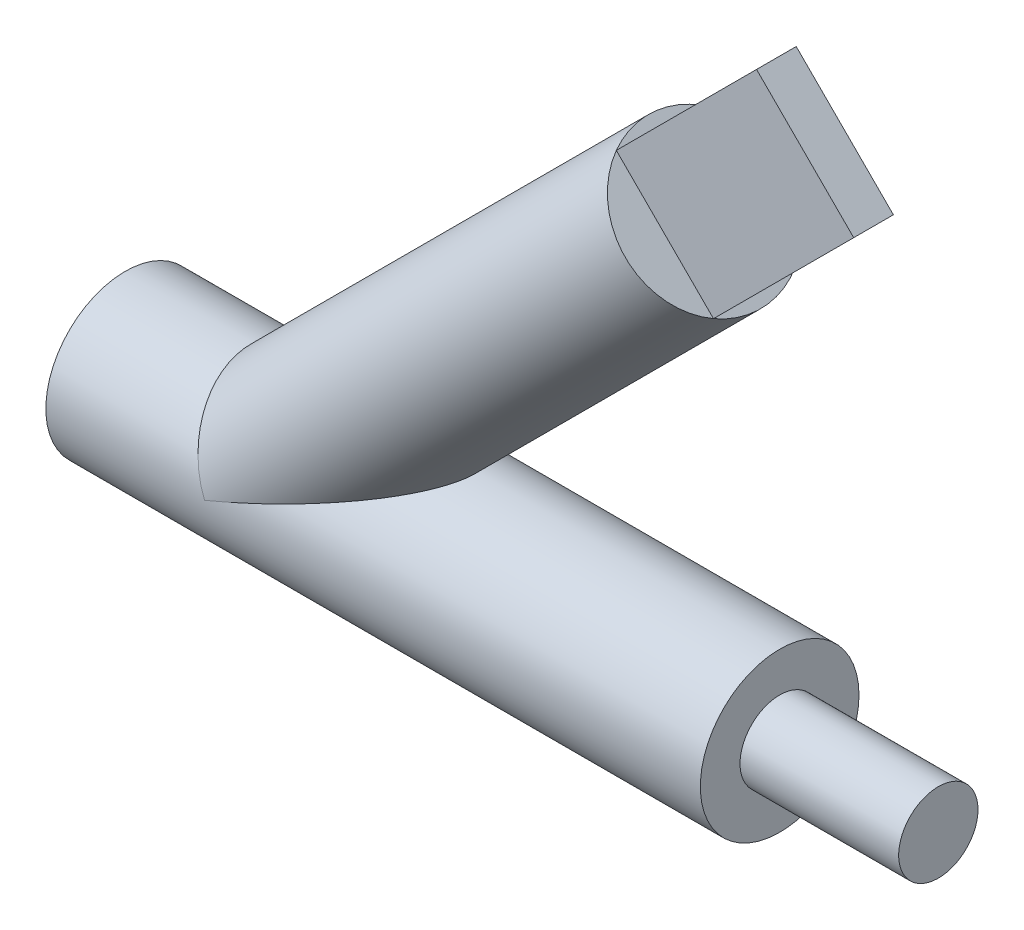
ISO-10303-21;
HEADER;
FILE_DESCRIPTION(('STEP AP214'),'2;1');
FILE_NAME('part.step','',(''),(''),'','','');
FILE_SCHEMA(('AUTOMOTIVE_DESIGN { 1 0 10303 214 1 1 1 1 }'));
ENDSEC;
DATA;
#1=APPLICATION_CONTEXT('core data for automotive mechanical design processes');
#2=APPLICATION_PROTOCOL_DEFINITION('international standard','automotive_design',2000,#1);
#3=PRODUCT_CONTEXT('',#1,'mechanical');
#4=PRODUCT('Part','Part','',(#3));
#5=PRODUCT_RELATED_PRODUCT_CATEGORY('part','',(#4));
#6=PRODUCT_DEFINITION_FORMATION('','',#4);
#7=PRODUCT_DEFINITION_CONTEXT('part definition',#1,'design');
#8=PRODUCT_DEFINITION('design','',#6,#7);
#9=PRODUCT_DEFINITION_SHAPE('','',#8);
#10=(LENGTH_UNIT() NAMED_UNIT(*) SI_UNIT(.MILLI.,.METRE.));
#11=(NAMED_UNIT(*) PLANE_ANGLE_UNIT() SI_UNIT($,.RADIAN.));
#12=(NAMED_UNIT(*) SI_UNIT($,.STERADIAN.) SOLID_ANGLE_UNIT());
#13=UNCERTAINTY_MEASURE_WITH_UNIT(LENGTH_MEASURE(1.E-05),#10,'distance_accuracy_value','');
#14=(GEOMETRIC_REPRESENTATION_CONTEXT(3) GLOBAL_UNCERTAINTY_ASSIGNED_CONTEXT((#13)) GLOBAL_UNIT_ASSIGNED_CONTEXT((#10,
#11,#12)) REPRESENTATION_CONTEXT('',''));
#15=CARTESIAN_POINT('',(0.,0.,0.));
#16=DIRECTION('',(0.,0.,1.));
#17=DIRECTION('',(1.,0.,0.));
#18=AXIS2_PLACEMENT_3D('',#15,#16,#17);
#19=CARTESIAN_POINT('',(146.066017177982,106.066017177982,0.));
#20=DIRECTION('',(0.707106781186549,0.707106781186546,0.));
#21=DIRECTION('',(-0.707106781186546,0.707106781186549,0.));
#22=AXIS2_PLACEMENT_3D('',#19,#20,#21);
#23=PLANE('',#22);
#24=DIRECTION('',(-0.707106781186546,0.707106781186549,0.));
#25=VECTOR('',#24,1.);
#26=CARTESIAN_POINT('',(126.066017177982,126.066017177982,0.));
#27=LINE('',#26,#25);
#28=CARTESIAN_POINT('',(158.313465891898,93.8185684640661,0.));
#29=VERTEX_POINT('',#28);
#30=CARTESIAN_POINT('',(133.818568464067,118.313465891898,0.));
#31=VERTEX_POINT('',#30);
#32=EDGE_CURVE('E52',#29,#31,#27,.T.);
#33=ORIENTED_EDGE('',*,*,#32,.F.);
#34=DIRECTION('',(0.,0.,1.));
#35=VECTOR('',#34,1.);
#36=CARTESIAN_POINT('',(158.313465891898,93.8185684640661,0.));
#37=LINE('',#36,#35);
#38=CARTESIAN_POINT('',(158.313465891898,93.818568464066,10.));
#39=VERTEX_POINT('',#38);
#40=EDGE_CURVE('E101',#29,#39,#37,.T.);
#41=ORIENTED_EDGE('',*,*,#40,.T.);
#42=CARTESIAN_POINT('',(146.066017177982,106.066017177982,0.));
#43=DIRECTION('',(0.707106781186549,0.707106781186546,0.));
#44=DIRECTION('',(-0.707106781186546,0.707106781186549,0.));
#45=AXIS2_PLACEMENT_3D('',#42,#43,#44);
#46=CIRCLE('',#45,20.);
#47=CARTESIAN_POINT('',(133.818568464067,118.313465891898,10.));
#48=VERTEX_POINT('',#47);
#49=EDGE_CURVE('E104',#39,#48,#46,.T.);
#50=ORIENTED_EDGE('',*,*,#49,.T.);
#51=DIRECTION('',(0.,0.,1.));
#52=VECTOR('',#51,1.);
#53=CARTESIAN_POINT('',(133.818568464067,118.313465891898,0.));
#54=LINE('',#53,#52);
#55=EDGE_CURVE('E57',#31,#48,#54,.T.);
#56=ORIENTED_EDGE('',*,*,#55,.F.);
#57=EDGE_LOOP('',(#33,#41,#50,#56));
#58=FACE_BOUND('',#57,.T.);
#59=ADVANCED_FACE('F37',(#58),#23,.T.);
#60=CARTESIAN_POINT('',(165.,0.,0.));
#61=DIRECTION('',(-1.,0.,0.));
#62=DIRECTION('',(0.,0.,1.));
#63=AXIS2_PLACEMENT_3D('',#60,#61,#62);
#64=CYLINDRICAL_SURFACE('',#63,20.);
#65=CARTESIAN_POINT('',(0.,0.,0.));
#66=DIRECTION('',(1.,0.,0.));
#67=DIRECTION('',(0.,0.,-1.));
#68=AXIS2_PLACEMENT_3D('',#65,#66,#67);
#69=CIRCLE('',#68,20.);
#70=CARTESIAN_POINT('',(0.,0.,-20.));
#71=VERTEX_POINT('',#70);
#72=EDGE_CURVE('E117',#71,#71,#69,.T.);
#73=ORIENTED_EDGE('',*,*,#72,.T.);
#74=EDGE_LOOP('',(#73));
#75=FACE_BOUND('',#74,.T.);
#76=CARTESIAN_POINT('',(165.,0.,0.));
#77=DIRECTION('',(1.,0.,0.));
#78=DIRECTION('',(0.,0.,-1.));
#79=AXIS2_PLACEMENT_3D('',#76,#77,#78);
#80=CIRCLE('',#79,20.);
#81=CARTESIAN_POINT('',(165.,0.,-20.));
#82=VERTEX_POINT('',#81);
#83=EDGE_CURVE('E120',#82,#82,#80,.T.);
#84=ORIENTED_EDGE('',*,*,#83,.F.);
#85=EDGE_LOOP('',(#84));
#86=FACE_BOUND('',#85,.T.);
#87=CARTESIAN_POINT('',(40.,0.,0.));
#88=DIRECTION('',(-0.923879532511287,-0.382683432365089,0.));
#89=DIRECTION('',(-0.382683432365089,0.923879532511287,0.));
#90=AXIS2_PLACEMENT_3D('',#87,#88,#89);
#91=ELLIPSE('',#90,21.6478440058479,20.);
#92=CARTESIAN_POINT('',(40.,0.,-20.));
#93=VERTEX_POINT('',#92);
#94=CARTESIAN_POINT('',(40.,0.,20.));
#95=VERTEX_POINT('',#94);
#96=EDGE_CURVE('E11',#93,#95,#91,.F.);
#97=ORIENTED_EDGE('',*,*,#96,.F.);
#98=CARTESIAN_POINT('',(40.,0.,0.));
#99=DIRECTION('',(-0.382683432365089,0.923879532511287,0.));
#100=DIRECTION('',(-0.923879532511287,-0.382683432365089,0.));
#101=AXIS2_PLACEMENT_3D('',#98,#99,#100);
#102=ELLIPSE('',#101,52.2625185950552,20.);
#103=EDGE_CURVE('E45',#95,#93,#102,.T.);
#104=ORIENTED_EDGE('',*,*,#103,.F.);
#105=EDGE_LOOP('',(#97,#104));
#106=FACE_BOUND('',#105,.T.);
#107=ADVANCED_FACE('F39',(#75,#86,#106),#64,.T.);
#108=CARTESIAN_POINT('',(165.,0.,0.));
#109=DIRECTION('',(1.,0.,0.));
#110=DIRECTION('',(0.,0.,-1.));
#111=AXIS2_PLACEMENT_3D('',#108,#109,#110);
#112=PLANE('',#111);
#113=ORIENTED_EDGE('',*,*,#83,.T.);
#114=EDGE_LOOP('',(#113));
#115=FACE_BOUND('',#114,.T.);
#116=CARTESIAN_POINT('',(165.,0.,0.));
#117=DIRECTION('',(1.,0.,0.));
#118=DIRECTION('',(0.,0.,-1.));
#119=AXIS2_PLACEMENT_3D('',#116,#117,#118);
#120=CIRCLE('',#119,10.);
#121=CARTESIAN_POINT('',(165.,0.,-10.));
#122=VERTEX_POINT('',#121);
#123=EDGE_CURVE('E113',#122,#122,#120,.T.);
#124=ORIENTED_EDGE('',*,*,#123,.F.);
#125=EDGE_LOOP('',(#124));
#126=FACE_BOUND('',#125,.T.);
#127=ADVANCED_FACE('F129',(#115,#126),#112,.T.);
#128=CARTESIAN_POINT('',(0.,0.,0.));
#129=DIRECTION('',(1.,0.,0.));
#130=DIRECTION('',(0.,0.,-1.));
#131=AXIS2_PLACEMENT_3D('',#128,#129,#130);
#132=PLANE('',#131);
#133=CARTESIAN_POINT('',(0.,0.,0.));
#134=DIRECTION('',(-1.,0.,0.));
#135=DIRECTION('',(0.,0.,1.));
#136=AXIS2_PLACEMENT_3D('',#133,#134,#135);
#137=CIRCLE('',#136,5.);
#138=CARTESIAN_POINT('',(0.,0.,5.));
#139=VERTEX_POINT('',#138);
#140=EDGE_CURVE('E192',#139,#139,#137,.T.);
#141=ORIENTED_EDGE('',*,*,#140,.F.);
#142=EDGE_LOOP('',(#141));
#143=FACE_BOUND('',#142,.T.);
#144=ORIENTED_EDGE('',*,*,#72,.F.);
#145=EDGE_LOOP('',(#144));
#146=FACE_BOUND('',#145,.T.);
#147=ADVANCED_FACE('F135',(#143,#146),#132,.F.);
#148=CARTESIAN_POINT('',(205.,0.,0.));
#149=DIRECTION('',(-1.,0.,0.));
#150=DIRECTION('',(0.,0.,1.));
#151=AXIS2_PLACEMENT_3D('',#148,#149,#150);
#152=CYLINDRICAL_SURFACE('',#151,10.);
#153=CARTESIAN_POINT('',(205.,0.,0.));
#154=DIRECTION('',(1.,0.,0.));
#155=DIRECTION('',(0.,0.,-1.));
#156=AXIS2_PLACEMENT_3D('',#153,#154,#155);
#157=CIRCLE('',#156,10.);
#158=CARTESIAN_POINT('',(205.,0.,-10.));
#159=VERTEX_POINT('',#158);
#160=EDGE_CURVE('E114',#159,#159,#157,.T.);
#161=ORIENTED_EDGE('',*,*,#160,.F.);
#162=EDGE_LOOP('',(#161));
#163=FACE_BOUND('',#162,.T.);
#164=ORIENTED_EDGE('',*,*,#123,.T.);
#165=EDGE_LOOP('',(#164));
#166=FACE_BOUND('',#165,.T.);
#167=ADVANCED_FACE('F146',(#163,#166),#152,.T.);
#168=CARTESIAN_POINT('',(205.,0.,0.));
#169=DIRECTION('',(1.,0.,0.));
#170=DIRECTION('',(0.,0.,-1.));
#171=AXIS2_PLACEMENT_3D('',#168,#169,#170);
#172=PLANE('',#171);
#173=ORIENTED_EDGE('',*,*,#160,.T.);
#174=EDGE_LOOP('',(#173));
#175=FACE_BOUND('',#174,.T.);
#176=ADVANCED_FACE('F148',(#175),#172,.T.);
#177=CARTESIAN_POINT('',(146.066017177982,106.066017177982,0.));
#178=DIRECTION('',(-0.707106781186549,-0.707106781186546,0.));
#179=DIRECTION('',(0.707106781186546,-0.707106781186549,0.));
#180=AXIS2_PLACEMENT_3D('',#177,#178,#179);
#181=CYLINDRICAL_SURFACE('',#180,20.);
#182=EDGE_CURVE('E106',#48,#39,#46,.T.);
#183=ORIENTED_EDGE('',*,*,#182,.F.);
#184=ORIENTED_EDGE('',*,*,#49,.F.);
#185=EDGE_LOOP('',(#183,#184));
#186=FACE_BOUND('',#185,.T.);
#187=ORIENTED_EDGE('',*,*,#103,.T.);
#188=ORIENTED_EDGE('',*,*,#96,.T.);
#189=EDGE_LOOP('',(#187,#188));
#190=FACE_BOUND('',#189,.T.);
#191=ADVANCED_FACE('F126',(#186,#190),#181,.T.);
#192=DIRECTION('',(0.707106781186546,-0.707106781186549,0.));
#193=VECTOR('',#192,1.);
#194=CARTESIAN_POINT('',(126.066017177982,126.066017177982,10.));
#195=LINE('',#194,#193);
#196=EDGE_CURVE('E202',#48,#39,#195,.T.);
#197=ORIENTED_EDGE('',*,*,#196,.F.);
#198=ORIENTED_EDGE('',*,*,#182,.T.);
#199=EDGE_LOOP('',(#197,#198));
#200=FACE_BOUND('',#199,.T.);
#201=ADVANCED_FACE('F139',(#200),#23,.T.);
#202=CARTESIAN_POINT('',(161.42135623731,161.421356237309,0.));
#203=DIRECTION('',(0.,0.,1.));
#204=DIRECTION('',(1.,0.,0.));
#205=AXIS2_PLACEMENT_3D('',#202,#203,#204);
#206=PLANE('',#205);
#207=ORIENTED_EDGE('',*,*,#32,.T.);
#208=DIRECTION('',(-0.707106781186549,-0.707106781186546,0.));
#209=VECTOR('',#208,1.);
#210=CARTESIAN_POINT('',(169.173907523394,153.668804951225,0.));
#211=LINE('',#210,#209);
#212=CARTESIAN_POINT('',(169.173907523394,153.668804951225,0.));
#213=VERTEX_POINT('',#212);
#214=EDGE_CURVE('E87',#213,#31,#211,.T.);
#215=ORIENTED_EDGE('',*,*,#214,.F.);
#216=DIRECTION('',(-0.707106781186546,0.707106781186549,0.));
#217=VECTOR('',#216,1.);
#218=CARTESIAN_POINT('',(161.42135623731,161.421356237309,0.));
#219=LINE('',#218,#217);
#220=CARTESIAN_POINT('',(193.668804951226,129.173907523393,0.));
#221=VERTEX_POINT('',#220);
#222=EDGE_CURVE('E93',#221,#213,#219,.T.);
#223=ORIENTED_EDGE('',*,*,#222,.F.);
#224=DIRECTION('',(-0.707106781186549,-0.707106781186546,0.));
#225=VECTOR('',#224,1.);
#226=CARTESIAN_POINT('',(193.668804951226,129.173907523393,0.));
#227=LINE('',#226,#225);
#228=EDGE_CURVE('E199',#221,#29,#227,.T.);
#229=ORIENTED_EDGE('',*,*,#228,.T.);
#230=EDGE_LOOP('',(#207,#215,#223,#229));
#231=FACE_BOUND('',#230,.T.);
#232=ADVANCED_FACE('F103',(#231),#206,.F.);
#233=CARTESIAN_POINT('',(169.173907523394,153.668804951225,0.));
#234=DIRECTION('',(0.707106781186546,-0.707106781186549,0.));
#235=DIRECTION('',(0.707106781186549,0.707106781186546,0.));
#236=AXIS2_PLACEMENT_3D('',#233,#234,#235);
#237=PLANE('',#236);
#238=ORIENTED_EDGE('',*,*,#55,.T.);
#239=DIRECTION('',(-0.707106781186549,-0.707106781186546,0.));
#240=VECTOR('',#239,1.);
#241=CARTESIAN_POINT('',(169.173907523394,153.668804951225,10.));
#242=LINE('',#241,#240);
#243=CARTESIAN_POINT('',(169.173907523394,153.668804951225,10.));
#244=VERTEX_POINT('',#243);
#245=EDGE_CURVE('E89',#244,#48,#242,.T.);
#246=ORIENTED_EDGE('',*,*,#245,.F.);
#247=DIRECTION('',(0.,0.,1.));
#248=VECTOR('',#247,1.);
#249=CARTESIAN_POINT('',(169.173907523394,153.668804951225,0.));
#250=LINE('',#249,#248);
#251=EDGE_CURVE('E83',#213,#244,#250,.T.);
#252=ORIENTED_EDGE('',*,*,#251,.F.);
#253=ORIENTED_EDGE('',*,*,#214,.T.);
#254=EDGE_LOOP('',(#238,#246,#252,#253));
#255=FACE_BOUND('',#254,.T.);
#256=ADVANCED_FACE('F85',(#255),#237,.F.);
#257=CARTESIAN_POINT('',(161.42135623731,161.421356237309,10.));
#258=DIRECTION('',(0.,0.,-1.));
#259=DIRECTION('',(-1.,0.,0.));
#260=AXIS2_PLACEMENT_3D('',#257,#258,#259);
#261=PLANE('',#260);
#262=ORIENTED_EDGE('',*,*,#196,.T.);
#263=DIRECTION('',(-0.707106781186549,-0.707106781186546,0.));
#264=VECTOR('',#263,1.);
#265=CARTESIAN_POINT('',(193.668804951226,129.173907523393,10.));
#266=LINE('',#265,#264);
#267=CARTESIAN_POINT('',(193.668804951226,129.173907523393,10.));
#268=VERTEX_POINT('',#267);
#269=EDGE_CURVE('E108',#268,#39,#266,.T.);
#270=ORIENTED_EDGE('',*,*,#269,.F.);
#271=DIRECTION('',(0.707106781186546,-0.707106781186549,0.));
#272=VECTOR('',#271,1.);
#273=CARTESIAN_POINT('',(161.42135623731,161.421356237309,10.));
#274=LINE('',#273,#272);
#275=EDGE_CURVE('E92',#244,#268,#274,.T.);
#276=ORIENTED_EDGE('',*,*,#275,.F.);
#277=ORIENTED_EDGE('',*,*,#245,.T.);
#278=EDGE_LOOP('',(#262,#270,#276,#277));
#279=FACE_BOUND('',#278,.T.);
#280=ADVANCED_FACE('F170',(#279),#261,.F.);
#281=CARTESIAN_POINT('',(193.668804951226,129.173907523393,0.));
#282=DIRECTION('',(0.707106781186546,-0.707106781186549,0.));
#283=DIRECTION('',(0.707106781186549,0.707106781186546,0.));
#284=AXIS2_PLACEMENT_3D('',#281,#282,#283);
#285=PLANE('',#284);
#286=ORIENTED_EDGE('',*,*,#40,.F.);
#287=ORIENTED_EDGE('',*,*,#228,.F.);
#288=DIRECTION('',(0.,0.,1.));
#289=VECTOR('',#288,1.);
#290=CARTESIAN_POINT('',(193.668804951226,129.173907523393,0.));
#291=LINE('',#290,#289);
#292=EDGE_CURVE('E99',#221,#268,#291,.T.);
#293=ORIENTED_EDGE('',*,*,#292,.T.);
#294=ORIENTED_EDGE('',*,*,#269,.T.);
#295=EDGE_LOOP('',(#286,#287,#293,#294));
#296=FACE_BOUND('',#295,.T.);
#297=ADVANCED_FACE('F173',(#296),#285,.T.);
#298=CARTESIAN_POINT('',(161.42135623731,161.421356237309,0.));
#299=DIRECTION('',(0.707106781186549,0.707106781186546,0.));
#300=DIRECTION('',(-0.707106781186546,0.707106781186549,0.));
#301=AXIS2_PLACEMENT_3D('',#298,#299,#300);
#302=PLANE('',#301);
#303=ORIENTED_EDGE('',*,*,#222,.T.);
#304=ORIENTED_EDGE('',*,*,#251,.T.);
#305=ORIENTED_EDGE('',*,*,#275,.T.);
#306=ORIENTED_EDGE('',*,*,#292,.F.);
#307=EDGE_LOOP('',(#303,#304,#305,#306));
#308=FACE_BOUND('',#307,.T.);
#309=ADVANCED_FACE('F97',(#308),#302,.T.);
#310=CARTESIAN_POINT('',(10.,0.,0.));
#311=DIRECTION('',(-1.,0.,0.));
#312=DIRECTION('',(0.,0.,1.));
#313=AXIS2_PLACEMENT_3D('',#310,#311,#312);
#314=CYLINDRICAL_SURFACE('',#313,5.);
#315=CARTESIAN_POINT('',(10.,0.,0.));
#316=DIRECTION('',(-1.,0.,0.));
#317=DIRECTION('',(0.,0.,1.));
#318=AXIS2_PLACEMENT_3D('',#315,#316,#317);
#319=CIRCLE('',#318,5.);
#320=CARTESIAN_POINT('',(10.,0.,5.));
#321=VERTEX_POINT('',#320);
#322=EDGE_CURVE('E191',#321,#321,#319,.T.);
#323=ORIENTED_EDGE('',*,*,#322,.F.);
#324=EDGE_LOOP('',(#323));
#325=FACE_BOUND('',#324,.T.);
#326=ORIENTED_EDGE('',*,*,#140,.T.);
#327=EDGE_LOOP('',(#326));
#328=FACE_BOUND('',#327,.T.);
#329=ADVANCED_FACE('F180',(#325,#328),#314,.F.);
#330=CARTESIAN_POINT('',(10.,0.,0.));
#331=DIRECTION('',(-1.,0.,0.));
#332=DIRECTION('',(0.,0.,1.));
#333=AXIS2_PLACEMENT_3D('',#330,#331,#332);
#334=PLANE('',#333);
#335=ORIENTED_EDGE('',*,*,#322,.T.);
#336=EDGE_LOOP('',(#335));
#337=FACE_BOUND('',#336,.T.);
#338=ADVANCED_FACE('F183',(#337),#334,.T.);
#339=CLOSED_SHELL('',(#59,#107,#127,#147,#167,#176,#191,#201,#232,#256,#280,#297,#309,#329,#338));
#340=MANIFOLD_SOLID_BREP('B2',#339);
#341=ADVANCED_BREP_SHAPE_REPRESENTATION('',(#18,#340),#14);
#342=SHAPE_DEFINITION_REPRESENTATION(#9,#341);
ENDSEC;
END-ISO-10303-21;
